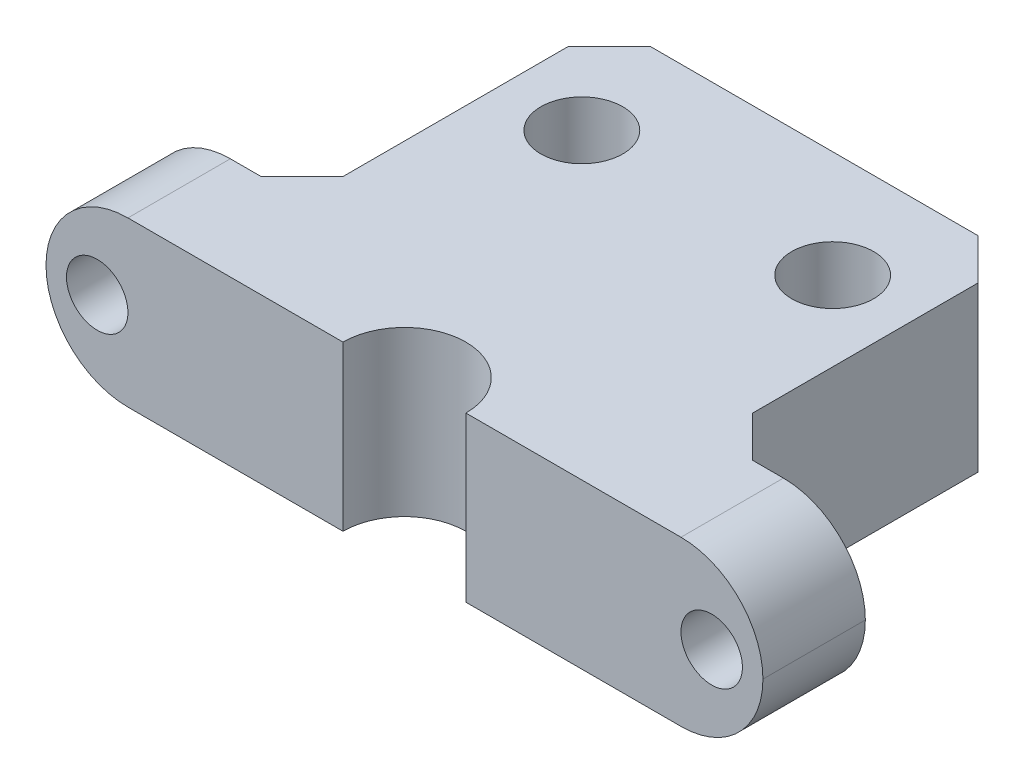
ISO-10303-21;
HEADER;
FILE_DESCRIPTION(('STEP AP214'),'2;1');
FILE_NAME('part.step','',(''),(''),'','','');
FILE_SCHEMA(('AUTOMOTIVE_DESIGN { 1 0 10303 214 1 1 1 1 }'));
ENDSEC;
DATA;
#1=APPLICATION_CONTEXT('core data for automotive mechanical design processes');
#2=APPLICATION_PROTOCOL_DEFINITION('international standard','automotive_design',2000,#1);
#3=PRODUCT_CONTEXT('',#1,'mechanical');
#4=PRODUCT('Part','Part','',(#3));
#5=PRODUCT_RELATED_PRODUCT_CATEGORY('part','',(#4));
#6=PRODUCT_DEFINITION_FORMATION('','',#4);
#7=PRODUCT_DEFINITION_CONTEXT('part definition',#1,'design');
#8=PRODUCT_DEFINITION('design','',#6,#7);
#9=PRODUCT_DEFINITION_SHAPE('','',#8);
#10=(LENGTH_UNIT() NAMED_UNIT(*) SI_UNIT(.MILLI.,.METRE.));
#11=(NAMED_UNIT(*) PLANE_ANGLE_UNIT() SI_UNIT($,.RADIAN.));
#12=(NAMED_UNIT(*) SI_UNIT($,.STERADIAN.) SOLID_ANGLE_UNIT());
#13=UNCERTAINTY_MEASURE_WITH_UNIT(LENGTH_MEASURE(1.E-05),#10,'distance_accuracy_value','');
#14=(GEOMETRIC_REPRESENTATION_CONTEXT(3) GLOBAL_UNCERTAINTY_ASSIGNED_CONTEXT((#13)) GLOBAL_UNIT_ASSIGNED_CONTEXT((#10,
#11,#12)) REPRESENTATION_CONTEXT('',''));
#15=CARTESIAN_POINT('',(0.,0.,0.));
#16=DIRECTION('',(0.,0.,1.));
#17=DIRECTION('',(1.,0.,0.));
#18=AXIS2_PLACEMENT_3D('',#15,#16,#17);
#19=CARTESIAN_POINT('',(0.,8.,0.));
#20=DIRECTION('',(0.,-1.,0.));
#21=DIRECTION('',(0.,0.,-1.));
#22=AXIS2_PLACEMENT_3D('',#19,#20,#21);
#23=CYLINDRICAL_SURFACE('',#22,3.);
#24=CARTESIAN_POINT('',(0.,0.,0.));
#25=DIRECTION('',(0.,1.,0.));
#26=DIRECTION('',(0.,0.,1.));
#27=AXIS2_PLACEMENT_3D('',#24,#25,#26);
#28=CIRCLE('',#27,3.);
#29=CARTESIAN_POINT('',(3.,0.,0.));
#30=VERTEX_POINT('',#29);
#31=CARTESIAN_POINT('',(-3.,0.,0.));
#32=VERTEX_POINT('',#31);
#33=EDGE_CURVE('E154',#30,#32,#28,.T.);
#34=ORIENTED_EDGE('',*,*,#33,.F.);
#35=DIRECTION('',(0.,-1.,0.));
#36=VECTOR('',#35,1.);
#37=CARTESIAN_POINT('',(3.,8.,0.));
#38=LINE('',#37,#36);
#39=CARTESIAN_POINT('',(3.,8.,0.));
#40=VERTEX_POINT('',#39);
#41=EDGE_CURVE('E148',#40,#30,#38,.T.);
#42=ORIENTED_EDGE('',*,*,#41,.F.);
#43=CARTESIAN_POINT('',(0.,8.,0.));
#44=DIRECTION('',(0.,1.,0.));
#45=DIRECTION('',(0.,0.,1.));
#46=AXIS2_PLACEMENT_3D('',#43,#44,#45);
#47=CIRCLE('',#46,3.);
#48=CARTESIAN_POINT('',(-3.,8.,0.));
#49=VERTEX_POINT('',#48);
#50=EDGE_CURVE('E152',#40,#49,#47,.T.);
#51=ORIENTED_EDGE('',*,*,#50,.T.);
#52=DIRECTION('',(0.,-1.,0.));
#53=VECTOR('',#52,1.);
#54=CARTESIAN_POINT('',(-3.,8.,0.));
#55=LINE('',#54,#53);
#56=EDGE_CURVE('E159',#49,#32,#55,.T.);
#57=ORIENTED_EDGE('',*,*,#56,.T.);
#58=EDGE_LOOP('',(#34,#42,#51,#57));
#59=FACE_BOUND('',#58,.T.);
#60=ADVANCED_FACE('F35',(#59),#23,.F.);
#61=CARTESIAN_POINT('',(0.,8.,0.));
#62=DIRECTION('',(0.,0.,-1.));
#63=DIRECTION('',(-1.,0.,0.));
#64=AXIS2_PLACEMENT_3D('',#61,#62,#63);
#65=PLANE('',#64);
#66=CARTESIAN_POINT('',(15.,4.,0.));
#67=DIRECTION('',(0.,0.,-1.));
#68=DIRECTION('',(-1.,0.,0.));
#69=AXIS2_PLACEMENT_3D('',#66,#67,#68);
#70=CIRCLE('',#69,1.5);
#71=CARTESIAN_POINT('',(13.5,4.,0.));
#72=VERTEX_POINT('',#71);
#73=EDGE_CURVE('E191',#72,#72,#70,.T.);
#74=ORIENTED_EDGE('',*,*,#73,.T.);
#75=EDGE_LOOP('',(#74));
#76=FACE_BOUND('',#75,.T.);
#77=DIRECTION('',(1.,0.,0.));
#78=VECTOR('',#77,1.);
#79=CARTESIAN_POINT('',(0.,0.,0.));
#80=LINE('',#79,#78);
#81=CARTESIAN_POINT('',(13.5,0.,0.));
#82=VERTEX_POINT('',#81);
#83=EDGE_CURVE('E177',#30,#82,#80,.T.);
#84=ORIENTED_EDGE('',*,*,#83,.T.);
#85=CARTESIAN_POINT('',(13.5,4.,0.));
#86=DIRECTION('',(0.,0.,-1.));
#87=DIRECTION('',(-1.,0.,0.));
#88=AXIS2_PLACEMENT_3D('',#85,#86,#87);
#89=CIRCLE('',#88,4.);
#90=CARTESIAN_POINT('',(17.5,4.,0.));
#91=VERTEX_POINT('',#90);
#92=EDGE_CURVE('E234',#82,#91,#89,.F.);
#93=ORIENTED_EDGE('',*,*,#92,.T.);
#94=CARTESIAN_POINT('',(13.5,4.,0.));
#95=DIRECTION('',(0.,0.,-1.));
#96=DIRECTION('',(-1.,0.,0.));
#97=AXIS2_PLACEMENT_3D('',#94,#95,#96);
#98=CIRCLE('',#97,4.);
#99=CARTESIAN_POINT('',(13.5,8.,0.));
#100=VERTEX_POINT('',#99);
#101=EDGE_CURVE('E165',#91,#100,#98,.F.);
#102=ORIENTED_EDGE('',*,*,#101,.T.);
#103=DIRECTION('',(1.,0.,0.));
#104=VECTOR('',#103,1.);
#105=CARTESIAN_POINT('',(0.,8.,0.));
#106=LINE('',#105,#104);
#107=EDGE_CURVE('E162',#40,#100,#106,.T.);
#108=ORIENTED_EDGE('',*,*,#107,.F.);
#109=ORIENTED_EDGE('',*,*,#41,.T.);
#110=EDGE_LOOP('',(#84,#93,#102,#108,#109));
#111=FACE_BOUND('',#110,.T.);
#112=ADVANCED_FACE('F163',(#76,#111),#65,.F.);
#113=CARTESIAN_POINT('',(0.,8.,-5.));
#114=DIRECTION('',(0.,0.,1.));
#115=DIRECTION('',(1.,0.,0.));
#116=AXIS2_PLACEMENT_3D('',#113,#114,#115);
#117=PLANE('',#116);
#118=CARTESIAN_POINT('',(15.,4.,-5.));
#119=DIRECTION('',(0.,0.,-1.));
#120=DIRECTION('',(-1.,0.,0.));
#121=AXIS2_PLACEMENT_3D('',#118,#119,#120);
#122=CIRCLE('',#121,1.5);
#123=CARTESIAN_POINT('',(13.5,4.,-5.));
#124=VERTEX_POINT('',#123);
#125=EDGE_CURVE('E524',#124,#124,#122,.T.);
#126=ORIENTED_EDGE('',*,*,#125,.F.);
#127=EDGE_LOOP('',(#126));
#128=FACE_BOUND('',#127,.T.);
#129=CARTESIAN_POINT('',(13.5,4.,-5.));
#130=DIRECTION('',(0.,0.,1.));
#131=DIRECTION('',(1.,0.,0.));
#132=AXIS2_PLACEMENT_3D('',#129,#130,#131);
#133=CIRCLE('',#132,4.);
#134=CARTESIAN_POINT('',(13.5,8.,-5.));
#135=VERTEX_POINT('',#134);
#136=CARTESIAN_POINT('',(17.5,4.,-5.));
#137=VERTEX_POINT('',#136);
#138=EDGE_CURVE('E236',#135,#137,#133,.F.);
#139=ORIENTED_EDGE('',*,*,#138,.T.);
#140=CARTESIAN_POINT('',(13.5,4.,-5.));
#141=DIRECTION('',(0.,0.,1.));
#142=DIRECTION('',(1.,0.,0.));
#143=AXIS2_PLACEMENT_3D('',#140,#141,#142);
#144=CIRCLE('',#143,4.);
#145=CARTESIAN_POINT('',(13.5,0.,-5.));
#146=VERTEX_POINT('',#145);
#147=EDGE_CURVE('E238',#137,#146,#144,.F.);
#148=ORIENTED_EDGE('',*,*,#147,.T.);
#149=DIRECTION('',(-1.,0.,0.));
#150=VECTOR('',#149,1.);
#151=CARTESIAN_POINT('',(0.,0.,-5.));
#152=LINE('',#151,#150);
#153=CARTESIAN_POINT('',(12.,0.,-5.));
#154=VERTEX_POINT('',#153);
#155=EDGE_CURVE('E193',#146,#154,#152,.T.);
#156=ORIENTED_EDGE('',*,*,#155,.T.);
#157=DIRECTION('',(0.,1.,0.));
#158=VECTOR('',#157,1.);
#159=CARTESIAN_POINT('',(12.,8.,-5.));
#160=LINE('',#159,#158);
#161=CARTESIAN_POINT('',(12.,8.,-5.));
#162=VERTEX_POINT('',#161);
#163=EDGE_CURVE('E206',#154,#162,#160,.T.);
#164=ORIENTED_EDGE('',*,*,#163,.T.);
#165=DIRECTION('',(-1.,0.,0.));
#166=VECTOR('',#165,1.);
#167=CARTESIAN_POINT('',(0.,8.,-5.));
#168=LINE('',#167,#166);
#169=EDGE_CURVE('E167',#135,#162,#168,.T.);
#170=ORIENTED_EDGE('',*,*,#169,.F.);
#171=EDGE_LOOP('',(#139,#148,#156,#164,#170));
#172=FACE_BOUND('',#171,.T.);
#173=ADVANCED_FACE('F307',(#128,#172),#117,.F.);
#174=CARTESIAN_POINT('',(10.,8.,0.));
#175=DIRECTION('',(1.,0.,0.));
#176=DIRECTION('',(0.,0.,-1.));
#177=AXIS2_PLACEMENT_3D('',#174,#175,#176);
#178=PLANE('',#177);
#179=DIRECTION('',(0.,0.,1.));
#180=VECTOR('',#179,1.);
#181=CARTESIAN_POINT('',(10.,0.,0.));
#182=LINE('',#181,#180);
#183=CARTESIAN_POINT('',(10.,0.,-18.));
#184=VERTEX_POINT('',#183);
#185=CARTESIAN_POINT('',(10.,0.,-7.00000000000002));
#186=VERTEX_POINT('',#185);
#187=EDGE_CURVE('E195',#184,#186,#182,.T.);
#188=ORIENTED_EDGE('',*,*,#187,.F.);
#189=DIRECTION('',(0.,1.,0.));
#190=VECTOR('',#189,1.);
#191=CARTESIAN_POINT('',(10.,8.,-18.));
#192=LINE('',#191,#190);
#193=CARTESIAN_POINT('',(10.,8.,-18.));
#194=VERTEX_POINT('',#193);
#195=EDGE_CURVE('E11',#184,#194,#192,.T.);
#196=ORIENTED_EDGE('',*,*,#195,.T.);
#197=DIRECTION('',(0.,0.,1.));
#198=VECTOR('',#197,1.);
#199=CARTESIAN_POINT('',(10.,8.,0.));
#200=LINE('',#199,#198);
#201=CARTESIAN_POINT('',(10.,8.,-7.00000000000002));
#202=VERTEX_POINT('',#201);
#203=EDGE_CURVE('E183',#194,#202,#200,.T.);
#204=ORIENTED_EDGE('',*,*,#203,.T.);
#205=DIRECTION('',(0.,-1.,0.));
#206=VECTOR('',#205,1.);
#207=CARTESIAN_POINT('',(10.,8.,-7.00000000000002));
#208=LINE('',#207,#206);
#209=EDGE_CURVE('E158',#202,#186,#208,.T.);
#210=ORIENTED_EDGE('',*,*,#209,.T.);
#211=EDGE_LOOP('',(#188,#196,#204,#210));
#212=FACE_BOUND('',#211,.T.);
#213=ADVANCED_FACE('F290',(#212),#178,.T.);
#214=CARTESIAN_POINT('',(0.,8.,-20.));
#215=DIRECTION('',(0.,0.,-1.));
#216=DIRECTION('',(-1.,0.,0.));
#217=AXIS2_PLACEMENT_3D('',#214,#215,#216);
#218=PLANE('',#217);
#219=DIRECTION('',(1.,0.,0.));
#220=VECTOR('',#219,1.);
#221=CARTESIAN_POINT('',(0.,0.,-20.));
#222=LINE('',#221,#220);
#223=CARTESIAN_POINT('',(-7.99999999999999,0.,-20.));
#224=VERTEX_POINT('',#223);
#225=CARTESIAN_POINT('',(8.00000000000001,0.,-20.));
#226=VERTEX_POINT('',#225);
#227=EDGE_CURVE('E197',#224,#226,#222,.T.);
#228=ORIENTED_EDGE('',*,*,#227,.F.);
#229=DIRECTION('',(0.,1.,0.));
#230=VECTOR('',#229,1.);
#231=CARTESIAN_POINT('',(-7.99999999999999,8.,-20.));
#232=LINE('',#231,#230);
#233=CARTESIAN_POINT('',(-7.99999999999999,8.,-20.));
#234=VERTEX_POINT('',#233);
#235=EDGE_CURVE('E269',#224,#234,#232,.T.);
#236=ORIENTED_EDGE('',*,*,#235,.T.);
#237=DIRECTION('',(1.,0.,0.));
#238=VECTOR('',#237,1.);
#239=CARTESIAN_POINT('',(0.,8.,-20.));
#240=LINE('',#239,#238);
#241=CARTESIAN_POINT('',(8.00000000000001,8.,-20.));
#242=VERTEX_POINT('',#241);
#243=EDGE_CURVE('E185',#234,#242,#240,.T.);
#244=ORIENTED_EDGE('',*,*,#243,.T.);
#245=DIRECTION('',(0.,-1.,0.));
#246=VECTOR('',#245,1.);
#247=CARTESIAN_POINT('',(8.00000000000001,8.,-20.));
#248=LINE('',#247,#246);
#249=EDGE_CURVE('E266',#242,#226,#248,.T.);
#250=ORIENTED_EDGE('',*,*,#249,.T.);
#251=EDGE_LOOP('',(#228,#236,#244,#250));
#252=FACE_BOUND('',#251,.T.);
#253=ADVANCED_FACE('F286',(#252),#218,.T.);
#254=CARTESIAN_POINT('',(-10.,8.,0.));
#255=DIRECTION('',(1.,0.,0.));
#256=DIRECTION('',(0.,0.,-1.));
#257=AXIS2_PLACEMENT_3D('',#254,#255,#256);
#258=PLANE('',#257);
#259=DIRECTION('',(0.,0.,1.));
#260=VECTOR('',#259,1.);
#261=CARTESIAN_POINT('',(-10.,8.,0.));
#262=LINE('',#261,#260);
#263=CARTESIAN_POINT('',(-10.,8.,-18.));
#264=VERTEX_POINT('',#263);
#265=CARTESIAN_POINT('',(-10.,8.,-6.99999999999999));
#266=VERTEX_POINT('',#265);
#267=EDGE_CURVE('E187',#264,#266,#262,.T.);
#268=ORIENTED_EDGE('',*,*,#267,.F.);
#269=DIRECTION('',(0.,-1.,0.));
#270=VECTOR('',#269,1.);
#271=CARTESIAN_POINT('',(-10.,0.,-18.));
#272=LINE('',#271,#270);
#273=CARTESIAN_POINT('',(-10.,0.,-18.));
#274=VERTEX_POINT('',#273);
#275=EDGE_CURVE('E252',#264,#274,#272,.T.);
#276=ORIENTED_EDGE('',*,*,#275,.T.);
#277=DIRECTION('',(0.,0.,1.));
#278=VECTOR('',#277,1.);
#279=CARTESIAN_POINT('',(-10.,0.,0.));
#280=LINE('',#279,#278);
#281=CARTESIAN_POINT('',(-10.,0.,-6.99999999999999));
#282=VERTEX_POINT('',#281);
#283=EDGE_CURVE('E200',#274,#282,#280,.T.);
#284=ORIENTED_EDGE('',*,*,#283,.T.);
#285=DIRECTION('',(0.,1.,0.));
#286=VECTOR('',#285,1.);
#287=CARTESIAN_POINT('',(-10.,8.,-6.99999999999999));
#288=LINE('',#287,#286);
#289=EDGE_CURVE('E212',#282,#266,#288,.T.);
#290=ORIENTED_EDGE('',*,*,#289,.T.);
#291=EDGE_LOOP('',(#268,#276,#284,#290));
#292=FACE_BOUND('',#291,.T.);
#293=ADVANCED_FACE('F277',(#292),#258,.F.);
#294=CARTESIAN_POINT('',(0.,8.,-5.));
#295=DIRECTION('',(0.,0.,-1.));
#296=DIRECTION('',(-1.,0.,0.));
#297=AXIS2_PLACEMENT_3D('',#294,#295,#296);
#298=PLANE('',#297);
#299=CARTESIAN_POINT('',(-15.,4.,-5.));
#300=DIRECTION('',(0.,0.,-1.));
#301=DIRECTION('',(-1.,0.,0.));
#302=AXIS2_PLACEMENT_3D('',#299,#300,#301);
#303=CIRCLE('',#302,1.5);
#304=CARTESIAN_POINT('',(-16.5,4.,-5.));
#305=VERTEX_POINT('',#304);
#306=EDGE_CURVE('E179',#305,#305,#303,.T.);
#307=ORIENTED_EDGE('',*,*,#306,.F.);
#308=EDGE_LOOP('',(#307));
#309=FACE_BOUND('',#308,.T.);
#310=DIRECTION('',(1.,0.,0.));
#311=VECTOR('',#310,1.);
#312=CARTESIAN_POINT('',(0.,0.,-5.));
#313=LINE('',#312,#311);
#314=CARTESIAN_POINT('',(-13.5,0.,-5.));
#315=VERTEX_POINT('',#314);
#316=CARTESIAN_POINT('',(-12.,0.,-5.));
#317=VERTEX_POINT('',#316);
#318=EDGE_CURVE('E175',#315,#317,#313,.T.);
#319=ORIENTED_EDGE('',*,*,#318,.F.);
#320=CARTESIAN_POINT('',(-13.5,4.,-5.));
#321=DIRECTION('',(0.,0.,-1.));
#322=DIRECTION('',(-1.,0.,0.));
#323=AXIS2_PLACEMENT_3D('',#320,#321,#322);
#324=CIRCLE('',#323,4.);
#325=CARTESIAN_POINT('',(-17.5,4.,-5.));
#326=VERTEX_POINT('',#325);
#327=EDGE_CURVE('E246',#315,#326,#324,.T.);
#328=ORIENTED_EDGE('',*,*,#327,.T.);
#329=CARTESIAN_POINT('',(-13.5,4.,-5.));
#330=DIRECTION('',(0.,0.,-1.));
#331=DIRECTION('',(-1.,0.,0.));
#332=AXIS2_PLACEMENT_3D('',#329,#330,#331);
#333=CIRCLE('',#332,4.);
#334=CARTESIAN_POINT('',(-13.5,8.,-5.));
#335=VERTEX_POINT('',#334);
#336=EDGE_CURVE('E244',#326,#335,#333,.T.);
#337=ORIENTED_EDGE('',*,*,#336,.T.);
#338=DIRECTION('',(1.,0.,0.));
#339=VECTOR('',#338,1.);
#340=CARTESIAN_POINT('',(0.,8.,-5.));
#341=LINE('',#340,#339);
#342=CARTESIAN_POINT('',(-12.,8.,-5.));
#343=VERTEX_POINT('',#342);
#344=EDGE_CURVE('E189',#335,#343,#341,.T.);
#345=ORIENTED_EDGE('',*,*,#344,.T.);
#346=DIRECTION('',(0.,-1.,0.));
#347=VECTOR('',#346,1.);
#348=CARTESIAN_POINT('',(-12.,8.,-5.));
#349=LINE('',#348,#347);
#350=EDGE_CURVE('E209',#343,#317,#349,.T.);
#351=ORIENTED_EDGE('',*,*,#350,.T.);
#352=EDGE_LOOP('',(#319,#328,#337,#345,#351));
#353=FACE_BOUND('',#352,.T.);
#354=ADVANCED_FACE('F374',(#309,#353),#298,.T.);
#355=CARTESIAN_POINT('',(-15.,4.,0.));
#356=DIRECTION('',(0.,0.,-1.));
#357=DIRECTION('',(-1.,0.,0.));
#358=AXIS2_PLACEMENT_3D('',#355,#356,#357);
#359=CIRCLE('',#358,1.5);
#360=CARTESIAN_POINT('',(-16.5,4.,0.));
#361=VERTEX_POINT('',#360);
#362=EDGE_CURVE('E522',#361,#361,#359,.T.);
#363=ORIENTED_EDGE('',*,*,#362,.T.);
#364=EDGE_LOOP('',(#363));
#365=FACE_BOUND('',#364,.T.);
#366=CARTESIAN_POINT('',(-13.5,4.,0.));
#367=DIRECTION('',(0.,0.,-1.));
#368=DIRECTION('',(-1.,0.,0.));
#369=AXIS2_PLACEMENT_3D('',#366,#367,#368);
#370=CIRCLE('',#369,4.);
#371=CARTESIAN_POINT('',(-13.5,8.,0.));
#372=VERTEX_POINT('',#371);
#373=CARTESIAN_POINT('',(-17.5,4.,0.));
#374=VERTEX_POINT('',#373);
#375=EDGE_CURVE('E240',#372,#374,#370,.F.);
#376=ORIENTED_EDGE('',*,*,#375,.T.);
#377=CARTESIAN_POINT('',(-13.5,4.,0.));
#378=DIRECTION('',(0.,0.,-1.));
#379=DIRECTION('',(-1.,0.,0.));
#380=AXIS2_PLACEMENT_3D('',#377,#378,#379);
#381=CIRCLE('',#380,4.);
#382=CARTESIAN_POINT('',(-13.5,0.,0.));
#383=VERTEX_POINT('',#382);
#384=EDGE_CURVE('E242',#374,#383,#381,.F.);
#385=ORIENTED_EDGE('',*,*,#384,.T.);
#386=EDGE_CURVE('E173',#383,#32,#80,.T.);
#387=ORIENTED_EDGE('',*,*,#386,.T.);
#388=ORIENTED_EDGE('',*,*,#56,.F.);
#389=EDGE_CURVE('E169',#372,#49,#106,.T.);
#390=ORIENTED_EDGE('',*,*,#389,.F.);
#391=EDGE_LOOP('',(#376,#385,#387,#388,#390));
#392=FACE_BOUND('',#391,.T.);
#393=ADVANCED_FACE('F318',(#365,#392),#65,.F.);
#394=CARTESIAN_POINT('',(0.,8.,0.));
#395=DIRECTION('',(0.,1.,0.));
#396=DIRECTION('',(0.,0.,1.));
#397=AXIS2_PLACEMENT_3D('',#394,#395,#396);
#398=PLANE('',#397);
#399=CARTESIAN_POINT('',(-6.12293491784144,8.,-14.7820725201806));
#400=DIRECTION('',(0.,1.,0.));
#401=DIRECTION('',(0.,0.,1.));
#402=AXIS2_PLACEMENT_3D('',#399,#400,#401);
#403=CIRCLE('',#402,2.);
#404=CARTESIAN_POINT('',(-6.12293491784144,8.,-12.7820725201806));
#405=VERTEX_POINT('',#404);
#406=EDGE_CURVE('E537',#405,#405,#403,.T.);
#407=ORIENTED_EDGE('',*,*,#406,.F.);
#408=EDGE_LOOP('',(#407));
#409=FACE_BOUND('',#408,.T.);
#410=CARTESIAN_POINT('',(6.12293491784144,8.,-14.7820725201806));
#411=DIRECTION('',(0.,1.,0.));
#412=DIRECTION('',(0.,0.,1.));
#413=AXIS2_PLACEMENT_3D('',#410,#411,#412);
#414=CIRCLE('',#413,2.);
#415=CARTESIAN_POINT('',(6.12293491784144,8.,-12.7820725201806));
#416=VERTEX_POINT('',#415);
#417=EDGE_CURVE('E531',#416,#416,#414,.T.);
#418=ORIENTED_EDGE('',*,*,#417,.F.);
#419=EDGE_LOOP('',(#418));
#420=FACE_BOUND('',#419,.T.);
#421=ORIENTED_EDGE('',*,*,#243,.F.);
#422=DIRECTION('',(-0.707106781186549,0.,0.707106781186546));
#423=VECTOR('',#422,1.);
#424=CARTESIAN_POINT('',(-14.,8.,-14.));
#425=LINE('',#424,#423);
#426=EDGE_CURVE('E43',#234,#264,#425,.T.);
#427=ORIENTED_EDGE('',*,*,#426,.T.);
#428=ORIENTED_EDGE('',*,*,#267,.T.);
#429=DIRECTION('',(-0.707106781186551,0.,0.707106781186544));
#430=VECTOR('',#429,1.);
#431=CARTESIAN_POINT('',(-12.,8.,-5.));
#432=LINE('',#431,#430);
#433=EDGE_CURVE('E224',#266,#343,#432,.T.);
#434=ORIENTED_EDGE('',*,*,#433,.T.);
#435=ORIENTED_EDGE('',*,*,#344,.F.);
#436=DIRECTION('',(0.,0.,1.));
#437=VECTOR('',#436,1.);
#438=CARTESIAN_POINT('',(-13.5,8.,0.));
#439=LINE('',#438,#437);
#440=EDGE_CURVE('E248',#335,#372,#439,.T.);
#441=ORIENTED_EDGE('',*,*,#440,.T.);
#442=ORIENTED_EDGE('',*,*,#389,.T.);
#443=ORIENTED_EDGE('',*,*,#50,.F.);
#444=ORIENTED_EDGE('',*,*,#107,.T.);
#445=DIRECTION('',(0.,0.,1.));
#446=VECTOR('',#445,1.);
#447=CARTESIAN_POINT('',(13.5,8.,0.));
#448=LINE('',#447,#446);
#449=EDGE_CURVE('E250',#100,#135,#448,.F.);
#450=ORIENTED_EDGE('',*,*,#449,.T.);
#451=ORIENTED_EDGE('',*,*,#169,.T.);
#452=DIRECTION('',(-0.707106781186543,0.,-0.707106781186552));
#453=VECTOR('',#452,1.);
#454=CARTESIAN_POINT('',(10.,8.,-7.00000000000002));
#455=LINE('',#454,#453);
#456=EDGE_CURVE('E218',#162,#202,#455,.T.);
#457=ORIENTED_EDGE('',*,*,#456,.T.);
#458=ORIENTED_EDGE('',*,*,#203,.F.);
#459=DIRECTION('',(0.707106781186547,0.,0.707106781186548));
#460=VECTOR('',#459,1.);
#461=CARTESIAN_POINT('',(14.,8.,-14.));
#462=LINE('',#461,#460);
#463=EDGE_CURVE('E55',#194,#242,#462,.F.);
#464=ORIENTED_EDGE('',*,*,#463,.T.);
#465=EDGE_LOOP('',(#421,#427,#428,#434,#435,#441,#442,#443,#444,#450,#451,#457,#458,#464));
#466=FACE_BOUND('',#465,.T.);
#467=ADVANCED_FACE('F170',(#409,#420,#466),#398,.T.);
#468=CARTESIAN_POINT('',(0.,0.,0.));
#469=DIRECTION('',(0.,1.,0.));
#470=DIRECTION('',(0.,0.,1.));
#471=AXIS2_PLACEMENT_3D('',#468,#469,#470);
#472=PLANE('',#471);
#473=CARTESIAN_POINT('',(-6.12293491784144,0.,-14.7820725201806));
#474=DIRECTION('',(0.,1.,0.));
#475=DIRECTION('',(0.,0.,1.));
#476=AXIS2_PLACEMENT_3D('',#473,#474,#475);
#477=CIRCLE('',#476,2.);
#478=CARTESIAN_POINT('',(-6.12293491784144,0.,-12.7820725201806));
#479=VERTEX_POINT('',#478);
#480=EDGE_CURVE('E259',#479,#479,#477,.T.);
#481=ORIENTED_EDGE('',*,*,#480,.T.);
#482=EDGE_LOOP('',(#481));
#483=FACE_BOUND('',#482,.T.);
#484=CARTESIAN_POINT('',(6.12293491784144,0.,-14.7820725201806));
#485=DIRECTION('',(0.,1.,0.));
#486=DIRECTION('',(0.,0.,1.));
#487=AXIS2_PLACEMENT_3D('',#484,#485,#486);
#488=CIRCLE('',#487,2.);
#489=CARTESIAN_POINT('',(6.12293491784144,0.,-12.7820725201806));
#490=VERTEX_POINT('',#489);
#491=EDGE_CURVE('E534',#490,#490,#488,.T.);
#492=ORIENTED_EDGE('',*,*,#491,.T.);
#493=EDGE_LOOP('',(#492));
#494=FACE_BOUND('',#493,.T.);
#495=ORIENTED_EDGE('',*,*,#283,.F.);
#496=DIRECTION('',(0.707106781186549,0.,-0.707106781186546));
#497=VECTOR('',#496,1.);
#498=CARTESIAN_POINT('',(-10.,0.,-18.));
#499=LINE('',#498,#497);
#500=EDGE_CURVE('E264',#274,#224,#499,.T.);
#501=ORIENTED_EDGE('',*,*,#500,.T.);
#502=ORIENTED_EDGE('',*,*,#227,.T.);
#503=DIRECTION('',(-0.707106781186547,0.,-0.707106781186548));
#504=VECTOR('',#503,1.);
#505=CARTESIAN_POINT('',(8.00000000000001,0.,-20.));
#506=LINE('',#505,#504);
#507=EDGE_CURVE('E262',#226,#184,#506,.F.);
#508=ORIENTED_EDGE('',*,*,#507,.T.);
#509=ORIENTED_EDGE('',*,*,#187,.T.);
#510=DIRECTION('',(0.707106781186543,0.,0.707106781186552));
#511=VECTOR('',#510,1.);
#512=CARTESIAN_POINT('',(8.50000000000007,0.,-8.49999999999997));
#513=LINE('',#512,#511);
#514=EDGE_CURVE('E215',#186,#154,#513,.T.);
#515=ORIENTED_EDGE('',*,*,#514,.T.);
#516=ORIENTED_EDGE('',*,*,#155,.F.);
#517=DIRECTION('',(0.,0.,1.));
#518=VECTOR('',#517,1.);
#519=CARTESIAN_POINT('',(13.5,0.,0.));
#520=LINE('',#519,#518);
#521=EDGE_CURVE('E230',#146,#82,#520,.T.);
#522=ORIENTED_EDGE('',*,*,#521,.T.);
#523=ORIENTED_EDGE('',*,*,#83,.F.);
#524=ORIENTED_EDGE('',*,*,#33,.T.);
#525=ORIENTED_EDGE('',*,*,#386,.F.);
#526=DIRECTION('',(0.,0.,1.));
#527=VECTOR('',#526,1.);
#528=CARTESIAN_POINT('',(-13.5,0.,0.));
#529=LINE('',#528,#527);
#530=EDGE_CURVE('E227',#383,#315,#529,.F.);
#531=ORIENTED_EDGE('',*,*,#530,.T.);
#532=ORIENTED_EDGE('',*,*,#318,.T.);
#533=DIRECTION('',(0.707106781186551,0.,-0.707106781186544));
#534=VECTOR('',#533,1.);
#535=CARTESIAN_POINT('',(-8.49999999999994,0.,-8.50000000000004));
#536=LINE('',#535,#534);
#537=EDGE_CURVE('E221',#317,#282,#536,.T.);
#538=ORIENTED_EDGE('',*,*,#537,.T.);
#539=EDGE_LOOP('',(#495,#501,#502,#508,#509,#515,#516,#522,#523,#524,#525,#531,#532,#538));
#540=FACE_BOUND('',#539,.T.);
#541=ADVANCED_FACE('F284',(#483,#494,#540),#472,.F.);
#542=CARTESIAN_POINT('',(10.,8.,-7.00000000000002));
#543=DIRECTION('',(-0.707106781186552,0.,0.707106781186543));
#544=DIRECTION('',(0.,-1.,0.));
#545=AXIS2_PLACEMENT_3D('',#542,#543,#544);
#546=PLANE('',#545);
#547=ORIENTED_EDGE('',*,*,#456,.F.);
#548=ORIENTED_EDGE('',*,*,#163,.F.);
#549=ORIENTED_EDGE('',*,*,#514,.F.);
#550=ORIENTED_EDGE('',*,*,#209,.F.);
#551=EDGE_LOOP('',(#547,#548,#549,#550));
#552=FACE_BOUND('',#551,.T.);
#553=ADVANCED_FACE('F294',(#552),#546,.F.);
#554=CARTESIAN_POINT('',(-12.,8.,-5.));
#555=DIRECTION('',(0.707106781186544,0.,0.707106781186551));
#556=DIRECTION('',(0.,-1.,0.));
#557=AXIS2_PLACEMENT_3D('',#554,#555,#556);
#558=PLANE('',#557);
#559=ORIENTED_EDGE('',*,*,#433,.F.);
#560=ORIENTED_EDGE('',*,*,#289,.F.);
#561=ORIENTED_EDGE('',*,*,#537,.F.);
#562=ORIENTED_EDGE('',*,*,#350,.F.);
#563=EDGE_LOOP('',(#559,#560,#561,#562));
#564=FACE_BOUND('',#563,.T.);
#565=ADVANCED_FACE('F327',(#564),#558,.F.);
#566=CARTESIAN_POINT('',(-15.,4.,0.));
#567=DIRECTION('',(0.,0.,-1.));
#568=DIRECTION('',(-1.,0.,0.));
#569=AXIS2_PLACEMENT_3D('',#566,#567,#568);
#570=CYLINDRICAL_SURFACE('',#569,1.5);
#571=ORIENTED_EDGE('',*,*,#362,.F.);
#572=EDGE_LOOP('',(#571));
#573=FACE_BOUND('',#572,.T.);
#574=ORIENTED_EDGE('',*,*,#306,.T.);
#575=EDGE_LOOP('',(#574));
#576=FACE_BOUND('',#575,.T.);
#577=ADVANCED_FACE('F330',(#573,#576),#570,.F.);
#578=CARTESIAN_POINT('',(15.,4.,0.));
#579=DIRECTION('',(0.,0.,-1.));
#580=DIRECTION('',(-1.,0.,0.));
#581=AXIS2_PLACEMENT_3D('',#578,#579,#580);
#582=CYLINDRICAL_SURFACE('',#581,1.5);
#583=ORIENTED_EDGE('',*,*,#73,.F.);
#584=EDGE_LOOP('',(#583));
#585=FACE_BOUND('',#584,.T.);
#586=ORIENTED_EDGE('',*,*,#125,.T.);
#587=EDGE_LOOP('',(#586));
#588=FACE_BOUND('',#587,.T.);
#589=ADVANCED_FACE('F337',(#585,#588),#582,.F.);
#590=CARTESIAN_POINT('',(13.5,4.,0.));
#591=DIRECTION('',(0.,0.,1.));
#592=DIRECTION('',(1.,0.,0.));
#593=AXIS2_PLACEMENT_3D('',#590,#591,#592);
#594=CYLINDRICAL_SURFACE('',#593,4.);
#595=DIRECTION('',(0.,0.,1.));
#596=VECTOR('',#595,1.);
#597=CARTESIAN_POINT('',(17.5,4.,0.));
#598=LINE('',#597,#596);
#599=EDGE_CURVE('E253',#137,#91,#598,.T.);
#600=ORIENTED_EDGE('',*,*,#599,.F.);
#601=ORIENTED_EDGE('',*,*,#138,.F.);
#602=ORIENTED_EDGE('',*,*,#449,.F.);
#603=ORIENTED_EDGE('',*,*,#101,.F.);
#604=EDGE_LOOP('',(#600,#601,#602,#603));
#605=FACE_BOUND('',#604,.T.);
#606=ADVANCED_FACE('F304',(#605),#594,.T.);
#607=CARTESIAN_POINT('',(13.5,4.,0.));
#608=DIRECTION('',(0.,0.,-1.));
#609=DIRECTION('',(-1.,0.,0.));
#610=AXIS2_PLACEMENT_3D('',#607,#608,#609);
#611=CYLINDRICAL_SURFACE('',#610,4.);
#612=ORIENTED_EDGE('',*,*,#147,.F.);
#613=ORIENTED_EDGE('',*,*,#599,.T.);
#614=ORIENTED_EDGE('',*,*,#92,.F.);
#615=ORIENTED_EDGE('',*,*,#521,.F.);
#616=EDGE_LOOP('',(#612,#613,#614,#615));
#617=FACE_BOUND('',#616,.T.);
#618=ADVANCED_FACE('F301',(#617),#611,.T.);
#619=CARTESIAN_POINT('',(-13.5,4.,0.));
#620=DIRECTION('',(0.,0.,-1.));
#621=DIRECTION('',(-1.,0.,0.));
#622=AXIS2_PLACEMENT_3D('',#619,#620,#621);
#623=CYLINDRICAL_SURFACE('',#622,4.);
#624=ORIENTED_EDGE('',*,*,#440,.F.);
#625=ORIENTED_EDGE('',*,*,#336,.F.);
#626=DIRECTION('',(0.,0.,1.));
#627=VECTOR('',#626,1.);
#628=CARTESIAN_POINT('',(-17.5,4.,-5.));
#629=LINE('',#628,#627);
#630=EDGE_CURVE('E256',#374,#326,#629,.F.);
#631=ORIENTED_EDGE('',*,*,#630,.F.);
#632=ORIENTED_EDGE('',*,*,#375,.F.);
#633=EDGE_LOOP('',(#624,#625,#631,#632));
#634=FACE_BOUND('',#633,.T.);
#635=ADVANCED_FACE('F334',(#634),#623,.T.);
#636=CARTESIAN_POINT('',(-13.5,4.,0.));
#637=DIRECTION('',(0.,0.,1.));
#638=DIRECTION('',(1.,0.,0.));
#639=AXIS2_PLACEMENT_3D('',#636,#637,#638);
#640=CYLINDRICAL_SURFACE('',#639,4.);
#641=ORIENTED_EDGE('',*,*,#327,.F.);
#642=ORIENTED_EDGE('',*,*,#530,.F.);
#643=ORIENTED_EDGE('',*,*,#384,.F.);
#644=ORIENTED_EDGE('',*,*,#630,.T.);
#645=EDGE_LOOP('',(#641,#642,#643,#644));
#646=FACE_BOUND('',#645,.T.);
#647=ADVANCED_FACE('F338',(#646),#640,.T.);
#648=CARTESIAN_POINT('',(6.12293491784144,0.,-14.7820725201806));
#649=DIRECTION('',(0.,1.,0.));
#650=DIRECTION('',(0.,0.,1.));
#651=AXIS2_PLACEMENT_3D('',#648,#649,#650);
#652=CYLINDRICAL_SURFACE('',#651,2.);
#653=ORIENTED_EDGE('',*,*,#491,.F.);
#654=EDGE_LOOP('',(#653));
#655=FACE_BOUND('',#654,.T.);
#656=ORIENTED_EDGE('',*,*,#417,.T.);
#657=EDGE_LOOP('',(#656));
#658=FACE_BOUND('',#657,.T.);
#659=ADVANCED_FACE('F341',(#655,#658),#652,.F.);
#660=CARTESIAN_POINT('',(-6.12293491784144,0.,-14.7820725201806));
#661=DIRECTION('',(0.,1.,0.));
#662=DIRECTION('',(0.,0.,1.));
#663=AXIS2_PLACEMENT_3D('',#660,#661,#662);
#664=CYLINDRICAL_SURFACE('',#663,2.);
#665=ORIENTED_EDGE('',*,*,#480,.F.);
#666=EDGE_LOOP('',(#665));
#667=FACE_BOUND('',#666,.T.);
#668=ORIENTED_EDGE('',*,*,#406,.T.);
#669=EDGE_LOOP('',(#668));
#670=FACE_BOUND('',#669,.T.);
#671=ADVANCED_FACE('F346',(#667,#670),#664,.F.);
#672=CARTESIAN_POINT('',(-10.,8.,-18.));
#673=DIRECTION('',(-0.707106781186546,0.,-0.707106781186549));
#674=DIRECTION('',(0.,1.,0.));
#675=AXIS2_PLACEMENT_3D('',#672,#673,#674);
#676=PLANE('',#675);
#677=ORIENTED_EDGE('',*,*,#426,.F.);
#678=ORIENTED_EDGE('',*,*,#235,.F.);
#679=ORIENTED_EDGE('',*,*,#500,.F.);
#680=ORIENTED_EDGE('',*,*,#275,.F.);
#681=EDGE_LOOP('',(#677,#678,#679,#680));
#682=FACE_BOUND('',#681,.T.);
#683=ADVANCED_FACE('F281',(#682),#676,.T.);
#684=CARTESIAN_POINT('',(8.00000000000001,8.,-20.));
#685=DIRECTION('',(-0.707106781186548,0.,0.707106781186547));
#686=DIRECTION('',(0.,-1.,0.));
#687=AXIS2_PLACEMENT_3D('',#684,#685,#686);
#688=PLANE('',#687);
#689=ORIENTED_EDGE('',*,*,#463,.F.);
#690=ORIENTED_EDGE('',*,*,#195,.F.);
#691=ORIENTED_EDGE('',*,*,#507,.F.);
#692=ORIENTED_EDGE('',*,*,#249,.F.);
#693=EDGE_LOOP('',(#689,#690,#691,#692));
#694=FACE_BOUND('',#693,.T.);
#695=ADVANCED_FACE('F37',(#694),#688,.F.);
#696=CLOSED_SHELL('',(#60,#112,#173,#213,#253,#293,#354,#393,#467,#541,#553,#565,#577,#589,#606,
#618,#635,#647,#659,#671,#683,#695));
#697=MANIFOLD_SOLID_BREP('B2',#696);
#698=ADVANCED_BREP_SHAPE_REPRESENTATION('',(#18,#697),#14);
#699=SHAPE_DEFINITION_REPRESENTATION(#9,#698);
ENDSEC;
END-ISO-10303-21;
